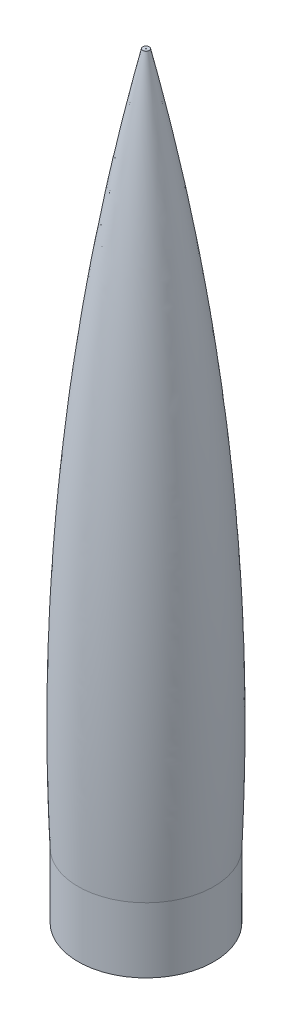
ISO-10303-21;
HEADER;
FILE_DESCRIPTION(('STEP AP214'),'2;1');
FILE_NAME('part.step','',(''),(''),'','','');
FILE_SCHEMA(('AUTOMOTIVE_DESIGN { 1 0 10303 214 1 1 1 1 }'));
ENDSEC;
DATA;
#1=APPLICATION_CONTEXT('core data for automotive mechanical design processes');
#2=APPLICATION_PROTOCOL_DEFINITION('international standard','automotive_design',2000,#1);
#3=PRODUCT_CONTEXT('',#1,'mechanical');
#4=PRODUCT('Part','Part','',(#3));
#5=PRODUCT_RELATED_PRODUCT_CATEGORY('part','',(#4));
#6=PRODUCT_DEFINITION_FORMATION('','',#4);
#7=PRODUCT_DEFINITION_CONTEXT('part definition',#1,'design');
#8=PRODUCT_DEFINITION('design','',#6,#7);
#9=PRODUCT_DEFINITION_SHAPE('','',#8);
#10=(LENGTH_UNIT() NAMED_UNIT(*) SI_UNIT(.MILLI.,.METRE.));
#11=(NAMED_UNIT(*) PLANE_ANGLE_UNIT() SI_UNIT($,.RADIAN.));
#12=(NAMED_UNIT(*) SI_UNIT($,.STERADIAN.) SOLID_ANGLE_UNIT());
#13=UNCERTAINTY_MEASURE_WITH_UNIT(LENGTH_MEASURE(1.E-05),#10,'distance_accuracy_value','');
#14=(GEOMETRIC_REPRESENTATION_CONTEXT(3) GLOBAL_UNCERTAINTY_ASSIGNED_CONTEXT((#13)) GLOBAL_UNIT_ASSIGNED_CONTEXT((#10,
#11,#12)) REPRESENTATION_CONTEXT('',''));
#15=CARTESIAN_POINT('',(0.,0.,0.));
#16=DIRECTION('',(0.,0.,1.));
#17=DIRECTION('',(1.,0.,0.));
#18=AXIS2_PLACEMENT_3D('',#15,#16,#17);
#19=CARTESIAN_POINT('',(52.9463,0.,0.));
#20=CARTESIAN_POINT('',(64.1734060707192,271.10694678709,0.));
#21=CARTESIAN_POINT('',(2.5146,539.75,0.));
#22=B_SPLINE_CURVE_WITH_KNOTS('',2,(#19,#20,#21),.UNSPECIFIED.,.F.,.F.,(3,3),(0.,1.),.UNSPECIFIED.);
#23=CARTESIAN_POINT('',(0.,0.,0.));
#24=DIRECTION('',(0.,-1.,0.));
#25=AXIS1_PLACEMENT('',#23,#24);
#26=SURFACE_OF_REVOLUTION('',#22,#25);
#27=CARTESIAN_POINT('',(0.,539.75,0.));
#28=DIRECTION('',(0.,-1.,0.));
#29=DIRECTION('',(0.,0.,-1.));
#30=AXIS2_PLACEMENT_3D('',#27,#28,#29);
#31=CIRCLE('',#30,2.5146);
#32=CARTESIAN_POINT('',(0.,539.75,-2.5146));
#33=VERTEX_POINT('',#32);
#34=EDGE_CURVE('E53',#33,#33,#31,.T.);
#35=ORIENTED_EDGE('',*,*,#34,.T.);
#36=EDGE_LOOP('',(#35));
#37=FACE_BOUND('',#36,.T.);
#38=CARTESIAN_POINT('',(0.,0.,0.));
#39=DIRECTION('',(0.,-1.,0.));
#40=DIRECTION('',(0.,0.,-1.));
#41=AXIS2_PLACEMENT_3D('',#38,#39,#40);
#42=CIRCLE('',#41,52.9463);
#43=CARTESIAN_POINT('',(0.,0.,-52.9463));
#44=VERTEX_POINT('',#43);
#45=EDGE_CURVE('E10',#44,#44,#42,.T.);
#46=ORIENTED_EDGE('',*,*,#45,.F.);
#47=EDGE_LOOP('',(#46));
#48=FACE_BOUND('',#47,.T.);
#49=ADVANCED_FACE('F35',(#37,#48),#26,.F.);
#50=CARTESIAN_POINT('',(0.,328.137428332122,0.));
#51=DIRECTION('',(0.,-1.,0.));
#52=DIRECTION('',(0.,0.,-1.));
#53=AXIS2_PLACEMENT_3D('',#50,#51,#52);
#54=CONICAL_SURFACE('',#53,27.7926785275023,0.0696537018731657);
#55=CARTESIAN_POINT('',(0.,0.,0.));
#56=DIRECTION('',(0.,-1.,0.));
#57=DIRECTION('',(0.,0.,-1.));
#58=AXIS2_PLACEMENT_3D('',#55,#56,#57);
#59=CIRCLE('',#58,50.6857);
#60=CARTESIAN_POINT('',(0.,0.,-50.6857));
#61=VERTEX_POINT('',#60);
#62=EDGE_CURVE('E69',#61,#61,#59,.T.);
#63=ORIENTED_EDGE('',*,*,#62,.T.);
#64=EDGE_LOOP('',(#63));
#65=FACE_BOUND('',#64,.T.);
#66=CARTESIAN_POINT('',(0.,328.137428332122,0.));
#67=DIRECTION('',(0.,-1.,0.));
#68=DIRECTION('',(0.,0.,-1.));
#69=AXIS2_PLACEMENT_3D('',#66,#67,#68);
#70=CIRCLE('',#69,27.7926785275023);
#71=CARTESIAN_POINT('',(0.,328.137428332123,-27.7926785275023));
#72=VERTEX_POINT('',#71);
#73=EDGE_CURVE('E43',#72,#72,#70,.T.);
#74=ORIENTED_EDGE('',*,*,#73,.F.);
#75=EDGE_LOOP('',(#74));
#76=FACE_BOUND('',#75,.T.);
#77=ADVANCED_FACE('F95',(#65,#76),#54,.F.);
#78=CARTESIAN_POINT('',(0.,539.75,0.));
#79=DIRECTION('',(0.,-1.,0.));
#80=DIRECTION('',(0.,0.,-1.));
#81=AXIS2_PLACEMENT_3D('',#78,#79,#80);
#82=CONICAL_SURFACE('',#81,0.253999999999997,0.129409972492776);
#83=CARTESIAN_POINT('',(0.,539.75,0.));
#84=DIRECTION('',(0.,-1.,0.));
#85=DIRECTION('',(0.,0.,-1.));
#86=AXIS2_PLACEMENT_3D('',#83,#84,#85);
#87=CIRCLE('',#86,0.253999999999997);
#88=CARTESIAN_POINT('',(0.,539.75,-0.25399999999999));
#89=VERTEX_POINT('',#88);
#90=EDGE_CURVE('E49',#89,#89,#87,.T.);
#91=CARTESIAN_POINT('',(0.,328.137428332123,-27.7926785275023));
#92=CARTESIAN_POINT('',(0.,330.341725953663,-27.5058172928409));
#93=CARTESIAN_POINT('',(0.,332.546023575203,-27.2189560581794));
#94=CARTESIAN_POINT('',(0.,336.954618818284,-26.6452335888564));
#95=CARTESIAN_POINT('',(0.,339.158916439824,-26.3583723541949));
#96=CARTESIAN_POINT('',(0.,343.567511682905,-25.784649884872));
#97=CARTESIAN_POINT('',(0.,345.771809304446,-25.4977886502105));
#98=CARTESIAN_POINT('',(0.,350.180404547526,-24.9240661808875));
#99=CARTESIAN_POINT('',(0.,352.384702169067,-24.637204946226));
#100=CARTESIAN_POINT('',(0.,356.793297412148,-24.0634824769031));
#101=CARTESIAN_POINT('',(0.,358.997595033688,-23.7766212422416));
#102=CARTESIAN_POINT('',(0.,363.406190276769,-23.2028987729186));
#103=CARTESIAN_POINT('',(0.,365.610487898309,-22.9160375382571));
#104=CARTESIAN_POINT('',(0.,370.01908314139,-22.3423150689342));
#105=CARTESIAN_POINT('',(0.,372.22338076293,-22.0554538342727));
#106=CARTESIAN_POINT('',(0.,376.631976006011,-21.4817313649497));
#107=CARTESIAN_POINT('',(0.,378.836273627551,-21.1948701302882));
#108=CARTESIAN_POINT('',(0.,383.244868870632,-20.6211476609653));
#109=CARTESIAN_POINT('',(0.,385.449166492173,-20.3342864263038));
#110=CARTESIAN_POINT('',(0.,389.857761735253,-19.7605639569808));
#111=CARTESIAN_POINT('',(0.,392.062059356794,-19.4737027223193));
#112=CARTESIAN_POINT('',(0.,396.470654599875,-18.8999802529964));
#113=CARTESIAN_POINT('',(0.,398.674952221415,-18.6131190183349));
#114=CARTESIAN_POINT('',(0.,403.083547464496,-18.0393965490119));
#115=CARTESIAN_POINT('',(0.,405.287845086036,-17.7525353143504));
#116=CARTESIAN_POINT('',(0.,409.696440329117,-17.1788128450275));
#117=CARTESIAN_POINT('',(0.,411.900737950657,-16.891951610366));
#118=CARTESIAN_POINT('',(0.,416.309333193738,-16.318229141043));
#119=CARTESIAN_POINT('',(0.,418.513630815278,-16.0313679063815));
#120=CARTESIAN_POINT('',(0.,422.922226058359,-15.4576454370586));
#121=CARTESIAN_POINT('',(0.,425.1265236799,-15.1707842023971));
#122=CARTESIAN_POINT('',(0.,429.53511892298,-14.5970617330741));
#123=CARTESIAN_POINT('',(0.,431.739416544521,-14.3102004984126));
#124=CARTESIAN_POINT('',(0.,436.148011787602,-13.7364780290897));
#125=CARTESIAN_POINT('',(0.,438.352309409142,-13.4496167944282));
#126=CARTESIAN_POINT('',(0.,442.760904652223,-12.8758943251052));
#127=CARTESIAN_POINT('',(0.,444.965202273763,-12.5890330904437));
#128=CARTESIAN_POINT('',(0.,449.373797516844,-12.0153106211208));
#129=CARTESIAN_POINT('',(0.,451.578095138384,-11.7284493864593));
#130=CARTESIAN_POINT('',(0.,455.986690381465,-11.1547269171363));
#131=CARTESIAN_POINT('',(0.,458.190988003006,-10.8678656824749));
#132=CARTESIAN_POINT('',(0.,462.599583246086,-10.2941432131519));
#133=CARTESIAN_POINT('',(0.,464.803880867627,-10.0072819784904));
#134=CARTESIAN_POINT('',(0.,469.212476110707,-9.43355950916744));
#135=CARTESIAN_POINT('',(0.,471.416773732248,-9.14669827450596));
#136=CARTESIAN_POINT('',(0.,475.825368975329,-8.57297580518299));
#137=CARTESIAN_POINT('',(0.,478.029666596869,-8.28611457052151));
#138=CARTESIAN_POINT('',(0.,482.43826183995,-7.71239210119854));
#139=CARTESIAN_POINT('',(0.,484.64255946149,-7.42553086653706));
#140=CARTESIAN_POINT('',(0.,489.051154704571,-6.85180839721409));
#141=CARTESIAN_POINT('',(0.,491.255452326111,-6.56494716255261));
#142=CARTESIAN_POINT('',(0.,495.664047569192,-5.99122469322964));
#143=CARTESIAN_POINT('',(0.,497.868345190733,-5.70436345856817));
#144=CARTESIAN_POINT('',(0.,502.276940433813,-5.1306409892452));
#145=CARTESIAN_POINT('',(0.,504.481238055354,-4.84377975458371));
#146=CARTESIAN_POINT('',(0.,508.889833298434,-4.27005728526075));
#147=CARTESIAN_POINT('',(0.,511.094130919975,-3.98319605059927));
#148=CARTESIAN_POINT('',(0.,515.502726163056,-3.4094735812763));
#149=CARTESIAN_POINT('',(0.,517.707023784596,-3.12261234661482));
#150=CARTESIAN_POINT('',(0.,522.115619027677,-2.54888987729185));
#151=CARTESIAN_POINT('',(0.,524.319916649217,-2.26202864263037));
#152=CARTESIAN_POINT('',(0.,528.728511892298,-1.68830617330741));
#153=CARTESIAN_POINT('',(0.,530.932809513838,-1.40144493864592));
#154=CARTESIAN_POINT('',(0.,535.341404756919,-0.827722469322957));
#155=CARTESIAN_POINT('',(0.,537.54570237846,-0.540861234661475));
#156=CARTESIAN_POINT('',(0.,539.75,-0.25399999999999));
#157=B_SPLINE_CURVE_WITH_KNOTS('',3,(#91,#92,#93,#94,#95,#96,#97,#98,#99,#100,#101,#102,#103,
#104,#105,#106,#107,#108,#109,#110,#111,#112,#113,#114,#115,#116,#117,#118,#119,#120,#121,#122,
#123,#124,#125,#126,#127,#128,#129,#130,#131,#132,#133,#134,#135,#136,#137,#138,#139,#140,#141,
#142,#143,#144,#145,#146,#147,#148,#149,#150,#151,#152,#153,#154,#155,#156),.UNSPECIFIED.,.F.,
.F.,(4,2,2,2,2,2,2,2,2,2,2,2,2,2,2,2,2,2,2,2,2,2,2,2,2,2,2,2,2,2,2,2,4),(0.,6.6686547631828,
13.3373095263657,20.0059642895485,26.6746190527314,33.3432738159142,40.011928579097,
46.6805833422799,53.3492381054627,60.0178928686456,66.6865476318284,73.3552023950113,
80.0238571581941,86.6925119213769,93.3611666845597,100.029821447743,106.698476210925,
113.367130974108,120.035785737291,126.704440500474,133.373095263657,140.04175002684,
146.710404790022,153.379059553205,160.047714316388,166.716369079571,173.385023842754,
180.053678605937,186.722333369119,193.390988132302,200.059642895485,206.728297658668,
213.396952421851),.UNSPECIFIED.);
#158=EDGE_CURVE('BSEAM90',#72,#89,#157,.T.);
#159=ORIENTED_EDGE('',*,*,#73,.T.);
#160=ORIENTED_EDGE('',*,*,#90,.F.);
#161=ORIENTED_EDGE('',*,*,#158,.T.);
#162=ORIENTED_EDGE('',*,*,#158,.F.);
#163=EDGE_LOOP('',(#159,#161,#160,#162));
#164=FACE_BOUND('',#163,.T.);
#165=ADVANCED_FACE('F90',(#164),#82,.F.);
#166=CARTESIAN_POINT('',(2.5146,539.75,0.));
#167=DIRECTION('',(0.,1.,0.));
#168=DIRECTION('',(0.,0.,1.));
#169=AXIS2_PLACEMENT_3D('',#166,#167,#168);
#170=PLANE('',#169);
#171=ORIENTED_EDGE('',*,*,#90,.T.);
#172=EDGE_LOOP('',(#171));
#173=FACE_BOUND('',#172,.T.);
#174=ORIENTED_EDGE('',*,*,#34,.F.);
#175=EDGE_LOOP('',(#174));
#176=FACE_BOUND('',#175,.T.);
#177=ADVANCED_FACE('F81',(#173,#176),#170,.T.);
#178=CARTESIAN_POINT('',(0.,-50.8,0.));
#179=DIRECTION('',(0.,-1.,0.));
#180=DIRECTION('',(0.,0.,-1.));
#181=AXIS2_PLACEMENT_3D('',#178,#179,#180);
#182=PLANE('',#181);
#183=CARTESIAN_POINT('',(0.,-50.8,0.));
#184=DIRECTION('',(0.,-1.,0.));
#185=DIRECTION('',(0.,0.,-1.));
#186=AXIS2_PLACEMENT_3D('',#183,#184,#185);
#187=CIRCLE('',#186,52.9463);
#188=CARTESIAN_POINT('',(0.,-50.8,-52.9463));
#189=VERTEX_POINT('',#188);
#190=EDGE_CURVE('E57',#189,#189,#187,.T.);
#191=ORIENTED_EDGE('',*,*,#190,.T.);
#192=EDGE_LOOP('',(#191));
#193=FACE_BOUND('',#192,.T.);
#194=CARTESIAN_POINT('',(0.,-50.8,0.));
#195=DIRECTION('',(0.,-1.,0.));
#196=DIRECTION('',(0.,0.,-1.));
#197=AXIS2_PLACEMENT_3D('',#194,#195,#196);
#198=CIRCLE('',#197,50.6857);
#199=CARTESIAN_POINT('',(0.,-50.8,-50.6857));
#200=VERTEX_POINT('',#199);
#201=EDGE_CURVE('E68',#200,#200,#198,.T.);
#202=ORIENTED_EDGE('',*,*,#201,.F.);
#203=EDGE_LOOP('',(#202));
#204=FACE_BOUND('',#203,.T.);
#205=ADVANCED_FACE('F78',(#193,#204),#182,.T.);
#206=CARTESIAN_POINT('',(0.,-50.8,0.));
#207=DIRECTION('',(0.,1.,0.));
#208=DIRECTION('',(0.,0.,1.));
#209=AXIS2_PLACEMENT_3D('',#206,#207,#208);
#210=CYLINDRICAL_SURFACE('',#209,52.9463);
#211=ORIENTED_EDGE('',*,*,#190,.F.);
#212=EDGE_LOOP('',(#211));
#213=FACE_BOUND('',#212,.T.);
#214=ORIENTED_EDGE('',*,*,#45,.T.);
#215=EDGE_LOOP('',(#214));
#216=FACE_BOUND('',#215,.T.);
#217=ADVANCED_FACE('F80',(#213,#216),#210,.T.);
#218=CARTESIAN_POINT('',(0.,-50.8,0.));
#219=DIRECTION('',(0.,1.,0.));
#220=DIRECTION('',(0.,0.,1.));
#221=AXIS2_PLACEMENT_3D('',#218,#219,#220);
#222=CYLINDRICAL_SURFACE('',#221,50.6857);
#223=ORIENTED_EDGE('',*,*,#201,.T.);
#224=EDGE_LOOP('',(#223));
#225=FACE_BOUND('',#224,.T.);
#226=ORIENTED_EDGE('',*,*,#62,.F.);
#227=EDGE_LOOP('',(#226));
#228=FACE_BOUND('',#227,.T.);
#229=ADVANCED_FACE('F75',(#225,#228),#222,.F.);
#230=CLOSED_SHELL('',(#49,#77,#165,#177,#205,#217,#229));
#231=MANIFOLD_SOLID_BREP('B2',#230);
#232=ADVANCED_BREP_SHAPE_REPRESENTATION('',(#18,#231),#14);
#233=SHAPE_DEFINITION_REPRESENTATION(#9,#232);
ENDSEC;
END-ISO-10303-21;
